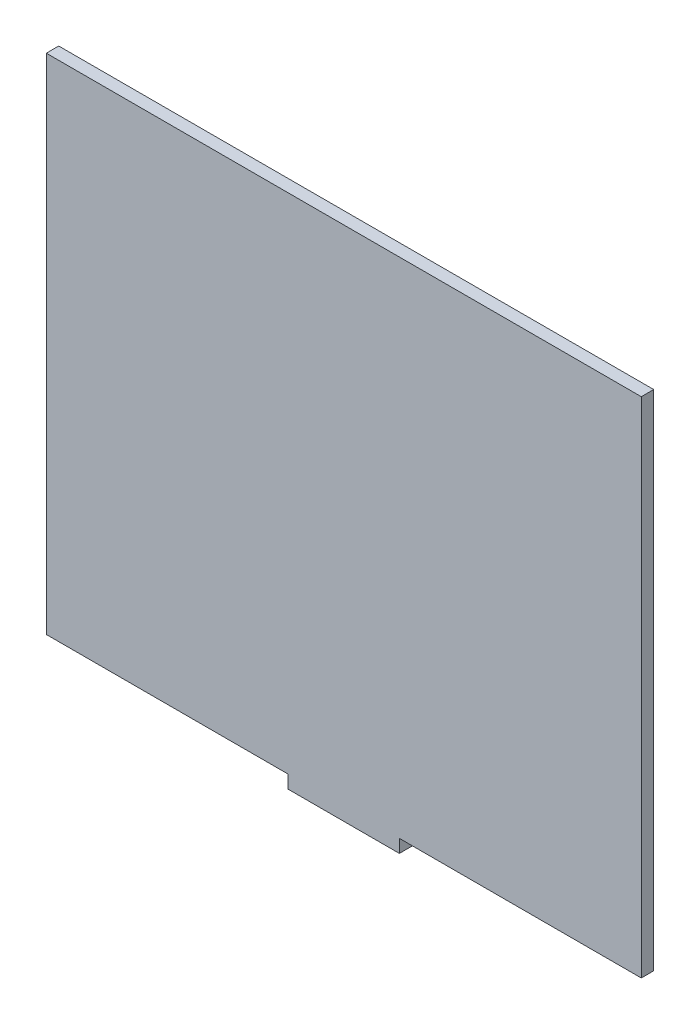
ISO-10303-21;
HEADER;
FILE_DESCRIPTION(('STEP AP214'),'2;1');
FILE_NAME('part.step','',(''),(''),'','','');
FILE_SCHEMA(('AUTOMOTIVE_DESIGN { 1 0 10303 214 1 1 1 1 }'));
ENDSEC;
DATA;
#1=APPLICATION_CONTEXT('core data for automotive mechanical design processes');
#2=APPLICATION_PROTOCOL_DEFINITION('international standard','automotive_design',2000,#1);
#3=PRODUCT_CONTEXT('',#1,'mechanical');
#4=PRODUCT('Part','Part','',(#3));
#5=PRODUCT_RELATED_PRODUCT_CATEGORY('part','',(#4));
#6=PRODUCT_DEFINITION_FORMATION('','',#4);
#7=PRODUCT_DEFINITION_CONTEXT('part definition',#1,'design');
#8=PRODUCT_DEFINITION('design','',#6,#7);
#9=PRODUCT_DEFINITION_SHAPE('','',#8);
#10=(LENGTH_UNIT() NAMED_UNIT(*) SI_UNIT(.MILLI.,.METRE.));
#11=(NAMED_UNIT(*) PLANE_ANGLE_UNIT() SI_UNIT($,.RADIAN.));
#12=(NAMED_UNIT(*) SI_UNIT($,.STERADIAN.) SOLID_ANGLE_UNIT());
#13=UNCERTAINTY_MEASURE_WITH_UNIT(LENGTH_MEASURE(1.E-05),#10,'distance_accuracy_value','');
#14=(GEOMETRIC_REPRESENTATION_CONTEXT(3) GLOBAL_UNCERTAINTY_ASSIGNED_CONTEXT((#13)) GLOBAL_UNIT_ASSIGNED_CONTEXT((#10,
#11,#12)) REPRESENTATION_CONTEXT('',''));
#15=CARTESIAN_POINT('',(0.,0.,0.));
#16=DIRECTION('',(0.,0.,1.));
#17=DIRECTION('',(1.,0.,0.));
#18=AXIS2_PLACEMENT_3D('',#15,#16,#17);
#19=CARTESIAN_POINT('',(45.5,0.,1.9));
#20=DIRECTION('',(1.,0.,0.));
#21=DIRECTION('',(0.,1.,0.));
#22=AXIS2_PLACEMENT_3D('',#19,#20,#21);
#23=PLANE('',#22);
#24=DIRECTION('',(0.,-1.,0.));
#25=VECTOR('',#24,1.);
#26=CARTESIAN_POINT('',(45.5,0.,0.));
#27=LINE('',#26,#25);
#28=CARTESIAN_POINT('',(45.5,38.5,0.));
#29=VERTEX_POINT('',#28);
#30=CARTESIAN_POINT('',(45.5,-38.5,0.));
#31=VERTEX_POINT('',#30);
#32=EDGE_CURVE('E133',#29,#31,#27,.T.);
#33=ORIENTED_EDGE('',*,*,#32,.F.);
#34=DIRECTION('',(0.,0.,-1.));
#35=VECTOR('',#34,1.);
#36=CARTESIAN_POINT('',(45.5,38.5,1.9));
#37=LINE('',#36,#35);
#38=CARTESIAN_POINT('',(45.5,38.5,1.9));
#39=VERTEX_POINT('',#38);
#40=EDGE_CURVE('E11',#39,#29,#37,.T.);
#41=ORIENTED_EDGE('',*,*,#40,.F.);
#42=DIRECTION('',(0.,-1.,0.));
#43=VECTOR('',#42,1.);
#44=CARTESIAN_POINT('',(45.5,0.,1.9));
#45=LINE('',#44,#43);
#46=CARTESIAN_POINT('',(45.5,-38.5,1.9));
#47=VERTEX_POINT('',#46);
#48=EDGE_CURVE('E174',#39,#47,#45,.T.);
#49=ORIENTED_EDGE('',*,*,#48,.T.);
#50=DIRECTION('',(0.,0.,-1.));
#51=VECTOR('',#50,1.);
#52=CARTESIAN_POINT('',(45.5,-38.5,1.9));
#53=LINE('',#52,#51);
#54=EDGE_CURVE('E91',#47,#31,#53,.T.);
#55=ORIENTED_EDGE('',*,*,#54,.T.);
#56=EDGE_LOOP('',(#33,#41,#49,#55));
#57=FACE_BOUND('',#56,.T.);
#58=ADVANCED_FACE('F40',(#57),#23,.T.);
#59=CARTESIAN_POINT('',(0.,38.5,1.9));
#60=DIRECTION('',(0.,1.,0.));
#61=DIRECTION('',(0.,0.,1.));
#62=AXIS2_PLACEMENT_3D('',#59,#60,#61);
#63=PLANE('',#62);
#64=DIRECTION('',(1.,0.,0.));
#65=VECTOR('',#64,1.);
#66=CARTESIAN_POINT('',(0.,38.5,0.));
#67=LINE('',#66,#65);
#68=CARTESIAN_POINT('',(-45.5,38.5,0.));
#69=VERTEX_POINT('',#68);
#70=EDGE_CURVE('E136',#69,#29,#67,.T.);
#71=ORIENTED_EDGE('',*,*,#70,.F.);
#72=DIRECTION('',(0.,0.,-1.));
#73=VECTOR('',#72,1.);
#74=CARTESIAN_POINT('',(-45.5,38.5,1.9));
#75=LINE('',#74,#73);
#76=CARTESIAN_POINT('',(-45.5,38.5,1.9));
#77=VERTEX_POINT('',#76);
#78=EDGE_CURVE('E48',#77,#69,#75,.T.);
#79=ORIENTED_EDGE('',*,*,#78,.F.);
#80=DIRECTION('',(1.,0.,0.));
#81=VECTOR('',#80,1.);
#82=CARTESIAN_POINT('',(0.,38.5,1.9));
#83=LINE('',#82,#81);
#84=EDGE_CURVE('E171',#77,#39,#83,.T.);
#85=ORIENTED_EDGE('',*,*,#84,.T.);
#86=ORIENTED_EDGE('',*,*,#40,.T.);
#87=EDGE_LOOP('',(#71,#79,#85,#86));
#88=FACE_BOUND('',#87,.T.);
#89=ADVANCED_FACE('F170',(#88),#63,.T.);
#90=CARTESIAN_POINT('',(-45.5,0.,1.9));
#91=DIRECTION('',(1.,0.,0.));
#92=DIRECTION('',(0.,0.,-1.));
#93=AXIS2_PLACEMENT_3D('',#90,#91,#92);
#94=PLANE('',#93);
#95=DIRECTION('',(0.,-1.,0.));
#96=VECTOR('',#95,1.);
#97=CARTESIAN_POINT('',(-45.5,0.,0.));
#98=LINE('',#97,#96);
#99=CARTESIAN_POINT('',(-45.5,-38.5,0.));
#100=VERTEX_POINT('',#99);
#101=EDGE_CURVE('E139',#69,#100,#98,.T.);
#102=ORIENTED_EDGE('',*,*,#101,.T.);
#103=DIRECTION('',(0.,0.,-1.));
#104=VECTOR('',#103,1.);
#105=CARTESIAN_POINT('',(-45.5,-38.5,1.9));
#106=LINE('',#105,#104);
#107=CARTESIAN_POINT('',(-45.5,-38.5,1.9));
#108=VERTEX_POINT('',#107);
#109=EDGE_CURVE('E154',#108,#100,#106,.T.);
#110=ORIENTED_EDGE('',*,*,#109,.F.);
#111=DIRECTION('',(0.,-1.,0.));
#112=VECTOR('',#111,1.);
#113=CARTESIAN_POINT('',(-45.5,0.,1.9));
#114=LINE('',#113,#112);
#115=EDGE_CURVE('E161',#77,#108,#114,.T.);
#116=ORIENTED_EDGE('',*,*,#115,.F.);
#117=ORIENTED_EDGE('',*,*,#78,.T.);
#118=EDGE_LOOP('',(#102,#110,#116,#117));
#119=FACE_BOUND('',#118,.T.);
#120=ADVANCED_FACE('F159',(#119),#94,.F.);
#121=CARTESIAN_POINT('',(0.,-38.5,1.9));
#122=DIRECTION('',(0.,1.,0.));
#123=DIRECTION('',(0.,0.,1.));
#124=AXIS2_PLACEMENT_3D('',#121,#122,#123);
#125=PLANE('',#124);
#126=DIRECTION('',(1.,0.,0.));
#127=VECTOR('',#126,1.);
#128=CARTESIAN_POINT('',(0.,-38.5,0.));
#129=LINE('',#128,#127);
#130=CARTESIAN_POINT('',(-8.5,-38.5,0.));
#131=VERTEX_POINT('',#130);
#132=EDGE_CURVE('E141',#100,#131,#129,.T.);
#133=ORIENTED_EDGE('',*,*,#132,.T.);
#134=DIRECTION('',(0.,0.,-1.));
#135=VECTOR('',#134,1.);
#136=CARTESIAN_POINT('',(-8.5,-38.5,1.9));
#137=LINE('',#136,#135);
#138=CARTESIAN_POINT('',(-8.5,-38.5,1.9));
#139=VERTEX_POINT('',#138);
#140=EDGE_CURVE('E151',#139,#131,#137,.T.);
#141=ORIENTED_EDGE('',*,*,#140,.F.);
#142=DIRECTION('',(1.,0.,0.));
#143=VECTOR('',#142,1.);
#144=CARTESIAN_POINT('',(0.,-38.5,1.9));
#145=LINE('',#144,#143);
#146=EDGE_CURVE('E130',#108,#139,#145,.T.);
#147=ORIENTED_EDGE('',*,*,#146,.F.);
#148=ORIENTED_EDGE('',*,*,#109,.T.);
#149=EDGE_LOOP('',(#133,#141,#147,#148));
#150=FACE_BOUND('',#149,.T.);
#151=ADVANCED_FACE('F181',(#150),#125,.F.);
#152=CARTESIAN_POINT('',(-8.5,0.,1.9));
#153=DIRECTION('',(1.,0.,0.));
#154=DIRECTION('',(0.,0.,-1.));
#155=AXIS2_PLACEMENT_3D('',#152,#153,#154);
#156=PLANE('',#155);
#157=DIRECTION('',(0.,-1.,0.));
#158=VECTOR('',#157,1.);
#159=CARTESIAN_POINT('',(-8.5,0.,0.));
#160=LINE('',#159,#158);
#161=CARTESIAN_POINT('',(-8.5,-40.5,0.));
#162=VERTEX_POINT('',#161);
#163=EDGE_CURVE('E143',#131,#162,#160,.T.);
#164=ORIENTED_EDGE('',*,*,#163,.T.);
#165=DIRECTION('',(0.,0.,-1.));
#166=VECTOR('',#165,1.);
#167=CARTESIAN_POINT('',(-8.5,-40.5,1.9));
#168=LINE('',#167,#166);
#169=CARTESIAN_POINT('',(-8.5,-40.5,1.9));
#170=VERTEX_POINT('',#169);
#171=EDGE_CURVE('E124',#170,#162,#168,.T.);
#172=ORIENTED_EDGE('',*,*,#171,.F.);
#173=DIRECTION('',(0.,-1.,0.));
#174=VECTOR('',#173,1.);
#175=CARTESIAN_POINT('',(-8.5,0.,1.9));
#176=LINE('',#175,#174);
#177=EDGE_CURVE('E115',#139,#170,#176,.T.);
#178=ORIENTED_EDGE('',*,*,#177,.F.);
#179=ORIENTED_EDGE('',*,*,#140,.T.);
#180=EDGE_LOOP('',(#164,#172,#178,#179));
#181=FACE_BOUND('',#180,.T.);
#182=ADVANCED_FACE('F183',(#181),#156,.F.);
#183=CARTESIAN_POINT('',(0.,-40.5,1.9));
#184=DIRECTION('',(0.,1.,0.));
#185=DIRECTION('',(0.,0.,1.));
#186=AXIS2_PLACEMENT_3D('',#183,#184,#185);
#187=PLANE('',#186);
#188=DIRECTION('',(1.,0.,0.));
#189=VECTOR('',#188,1.);
#190=CARTESIAN_POINT('',(0.,-40.5,0.));
#191=LINE('',#190,#189);
#192=CARTESIAN_POINT('',(8.5,-40.5,0.));
#193=VERTEX_POINT('',#192);
#194=EDGE_CURVE('E123',#162,#193,#191,.T.);
#195=ORIENTED_EDGE('',*,*,#194,.T.);
#196=DIRECTION('',(0.,0.,-1.));
#197=VECTOR('',#196,1.);
#198=CARTESIAN_POINT('',(8.5,-40.5,1.9));
#199=LINE('',#198,#197);
#200=CARTESIAN_POINT('',(8.5,-40.5,1.9));
#201=VERTEX_POINT('',#200);
#202=EDGE_CURVE('E120',#201,#193,#199,.T.);
#203=ORIENTED_EDGE('',*,*,#202,.F.);
#204=DIRECTION('',(1.,0.,0.));
#205=VECTOR('',#204,1.);
#206=CARTESIAN_POINT('',(0.,-40.5,1.9));
#207=LINE('',#206,#205);
#208=EDGE_CURVE('E109',#170,#201,#207,.T.);
#209=ORIENTED_EDGE('',*,*,#208,.F.);
#210=ORIENTED_EDGE('',*,*,#171,.T.);
#211=EDGE_LOOP('',(#195,#203,#209,#210));
#212=FACE_BOUND('',#211,.T.);
#213=ADVANCED_FACE('F121',(#212),#187,.F.);
#214=CARTESIAN_POINT('',(8.5,0.,1.9));
#215=DIRECTION('',(-1.,0.,0.));
#216=DIRECTION('',(0.,0.,1.));
#217=AXIS2_PLACEMENT_3D('',#214,#215,#216);
#218=PLANE('',#217);
#219=DIRECTION('',(0.,1.,0.));
#220=VECTOR('',#219,1.);
#221=CARTESIAN_POINT('',(8.5,0.,0.));
#222=LINE('',#221,#220);
#223=CARTESIAN_POINT('',(8.5,-38.5,0.));
#224=VERTEX_POINT('',#223);
#225=EDGE_CURVE('E84',#193,#224,#222,.T.);
#226=ORIENTED_EDGE('',*,*,#225,.T.);
#227=DIRECTION('',(0.,0.,-1.));
#228=VECTOR('',#227,1.);
#229=CARTESIAN_POINT('',(8.5,-38.5,1.9));
#230=LINE('',#229,#228);
#231=CARTESIAN_POINT('',(8.5,-38.5,1.9));
#232=VERTEX_POINT('',#231);
#233=EDGE_CURVE('E125',#232,#224,#230,.T.);
#234=ORIENTED_EDGE('',*,*,#233,.F.);
#235=DIRECTION('',(0.,1.,0.));
#236=VECTOR('',#235,1.);
#237=CARTESIAN_POINT('',(8.5,0.,1.9));
#238=LINE('',#237,#236);
#239=EDGE_CURVE('E113',#201,#232,#238,.T.);
#240=ORIENTED_EDGE('',*,*,#239,.F.);
#241=ORIENTED_EDGE('',*,*,#202,.T.);
#242=EDGE_LOOP('',(#226,#234,#240,#241));
#243=FACE_BOUND('',#242,.T.);
#244=ADVANCED_FACE('F127',(#243),#218,.F.);
#245=EDGE_CURVE('E144',#224,#31,#129,.T.);
#246=ORIENTED_EDGE('',*,*,#245,.T.);
#247=ORIENTED_EDGE('',*,*,#54,.F.);
#248=EDGE_CURVE('E56',#232,#47,#145,.T.);
#249=ORIENTED_EDGE('',*,*,#248,.F.);
#250=ORIENTED_EDGE('',*,*,#233,.T.);
#251=EDGE_LOOP('',(#246,#247,#249,#250));
#252=FACE_BOUND('',#251,.T.);
#253=ADVANCED_FACE('F192',(#252),#125,.F.);
#254=CARTESIAN_POINT('',(0.,0.,1.9));
#255=DIRECTION('',(0.,0.,1.));
#256=DIRECTION('',(1.,0.,0.));
#257=AXIS2_PLACEMENT_3D('',#254,#255,#256);
#258=PLANE('',#257);
#259=ORIENTED_EDGE('',*,*,#48,.F.);
#260=ORIENTED_EDGE('',*,*,#84,.F.);
#261=ORIENTED_EDGE('',*,*,#115,.T.);
#262=ORIENTED_EDGE('',*,*,#146,.T.);
#263=ORIENTED_EDGE('',*,*,#177,.T.);
#264=ORIENTED_EDGE('',*,*,#208,.T.);
#265=ORIENTED_EDGE('',*,*,#239,.T.);
#266=ORIENTED_EDGE('',*,*,#248,.T.);
#267=EDGE_LOOP('',(#259,#260,#261,#262,#263,#264,#265,#266));
#268=FACE_BOUND('',#267,.T.);
#269=ADVANCED_FACE('F111',(#268),#258,.T.);
#270=CARTESIAN_POINT('',(0.,0.,0.));
#271=DIRECTION('',(0.,0.,1.));
#272=DIRECTION('',(1.,0.,0.));
#273=AXIS2_PLACEMENT_3D('',#270,#271,#272);
#274=PLANE('',#273);
#275=ORIENTED_EDGE('',*,*,#32,.T.);
#276=ORIENTED_EDGE('',*,*,#245,.F.);
#277=ORIENTED_EDGE('',*,*,#225,.F.);
#278=ORIENTED_EDGE('',*,*,#194,.F.);
#279=ORIENTED_EDGE('',*,*,#163,.F.);
#280=ORIENTED_EDGE('',*,*,#132,.F.);
#281=ORIENTED_EDGE('',*,*,#101,.F.);
#282=ORIENTED_EDGE('',*,*,#70,.T.);
#283=EDGE_LOOP('',(#275,#276,#277,#278,#279,#280,#281,#282));
#284=FACE_BOUND('',#283,.T.);
#285=ADVANCED_FACE('F168',(#284),#274,.F.);
#286=CLOSED_SHELL('',(#58,#89,#120,#151,#182,#213,#244,#253,#269,#285));
#287=MANIFOLD_SOLID_BREP('B2',#286);
#288=ADVANCED_BREP_SHAPE_REPRESENTATION('',(#18,#287),#14);
#289=SHAPE_DEFINITION_REPRESENTATION(#9,#288);
ENDSEC;
END-ISO-10303-21;
